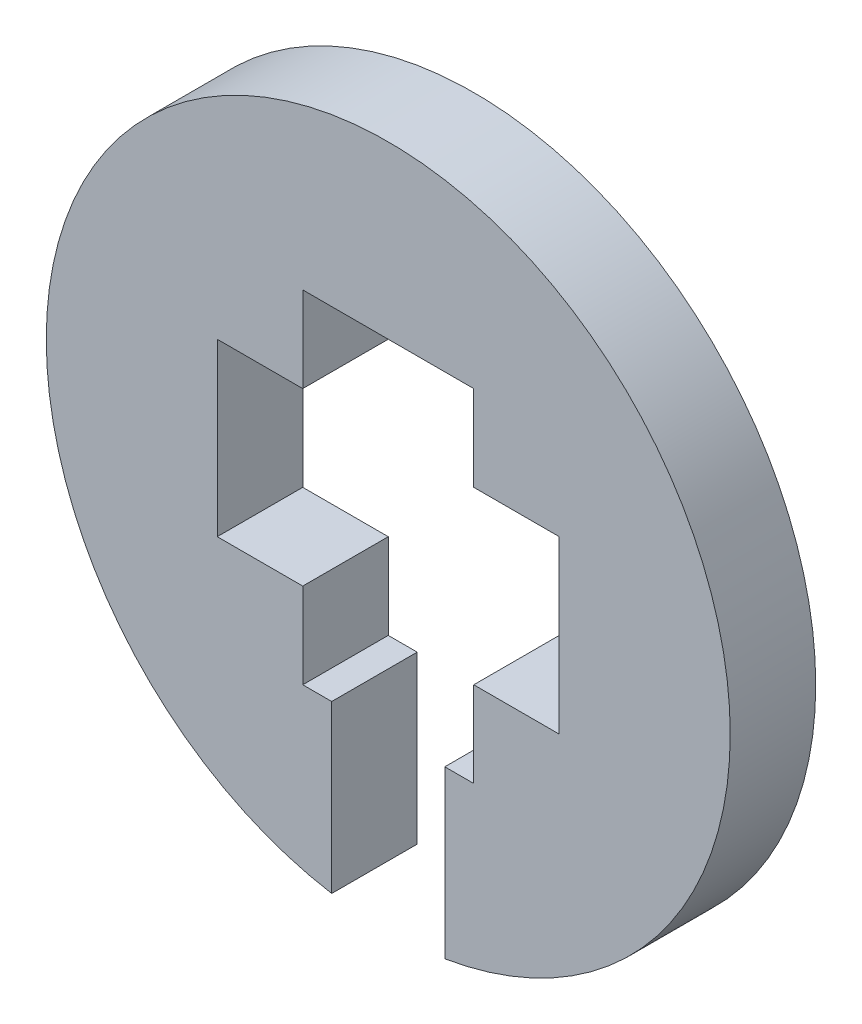
ISO-10303-21;
HEADER;
FILE_DESCRIPTION(('STEP AP214'),'2;1');
FILE_NAME('part.step','',(''),(''),'','','');
FILE_SCHEMA(('AUTOMOTIVE_DESIGN { 1 0 10303 214 1 1 1 1 }'));
ENDSEC;
DATA;
#1=APPLICATION_CONTEXT('core data for automotive mechanical design processes');
#2=APPLICATION_PROTOCOL_DEFINITION('international standard','automotive_design',2000,#1);
#3=PRODUCT_CONTEXT('',#1,'mechanical');
#4=PRODUCT('Part','Part','',(#3));
#5=PRODUCT_RELATED_PRODUCT_CATEGORY('part','',(#4));
#6=PRODUCT_DEFINITION_FORMATION('','',#4);
#7=PRODUCT_DEFINITION_CONTEXT('part definition',#1,'design');
#8=PRODUCT_DEFINITION('design','',#6,#7);
#9=PRODUCT_DEFINITION_SHAPE('','',#8);
#10=(LENGTH_UNIT() NAMED_UNIT(*) SI_UNIT(.MILLI.,.METRE.));
#11=(NAMED_UNIT(*) PLANE_ANGLE_UNIT() SI_UNIT($,.RADIAN.));
#12=(NAMED_UNIT(*) SI_UNIT($,.STERADIAN.) SOLID_ANGLE_UNIT());
#13=UNCERTAINTY_MEASURE_WITH_UNIT(LENGTH_MEASURE(1.E-05),#10,'distance_accuracy_value','');
#14=(GEOMETRIC_REPRESENTATION_CONTEXT(3) GLOBAL_UNCERTAINTY_ASSIGNED_CONTEXT((#13)) GLOBAL_UNIT_ASSIGNED_CONTEXT((#10,
#11,#12)) REPRESENTATION_CONTEXT('',''));
#15=CARTESIAN_POINT('',(0.,0.,0.));
#16=DIRECTION('',(0.,0.,1.));
#17=DIRECTION('',(1.,0.,0.));
#18=AXIS2_PLACEMENT_3D('',#15,#16,#17);
#19=CARTESIAN_POINT('',(-1.5875,-3.175,1.5875));
#20=DIRECTION('',(0.,1.,0.));
#21=DIRECTION('',(0.,0.,1.));
#22=AXIS2_PLACEMENT_3D('',#19,#20,#21);
#23=PLANE('',#22);
#24=DIRECTION('',(0.,0.,-1.));
#25=VECTOR('',#24,1.);
#26=CARTESIAN_POINT('',(1.05,-3.175,1.5875));
#27=LINE('',#26,#25);
#28=CARTESIAN_POINT('',(1.05,-3.175,1.5875));
#29=VERTEX_POINT('',#28);
#30=CARTESIAN_POINT('',(1.05,-3.175,0.));
#31=VERTEX_POINT('',#30);
#32=EDGE_CURVE('E151',#29,#31,#27,.T.);
#33=ORIENTED_EDGE('',*,*,#32,.F.);
#34=DIRECTION('',(1.,0.,0.));
#35=VECTOR('',#34,1.);
#36=CARTESIAN_POINT('',(-1.5875,-3.175,1.5875));
#37=LINE('',#36,#35);
#38=CARTESIAN_POINT('',(1.5875,-3.175,1.5875));
#39=VERTEX_POINT('',#38);
#40=EDGE_CURVE('E165',#29,#39,#37,.T.);
#41=ORIENTED_EDGE('',*,*,#40,.T.);
#42=DIRECTION('',(0.,0.,-1.));
#43=VECTOR('',#42,1.);
#44=CARTESIAN_POINT('',(1.5875,-3.175,1.5875));
#45=LINE('',#44,#43);
#46=CARTESIAN_POINT('',(1.5875,-3.175,0.));
#47=VERTEX_POINT('',#46);
#48=EDGE_CURVE('E249',#39,#47,#45,.T.);
#49=ORIENTED_EDGE('',*,*,#48,.T.);
#50=DIRECTION('',(1.,0.,0.));
#51=VECTOR('',#50,1.);
#52=CARTESIAN_POINT('',(-1.5875,-3.175,0.));
#53=LINE('',#52,#51);
#54=EDGE_CURVE('E195',#31,#47,#53,.T.);
#55=ORIENTED_EDGE('',*,*,#54,.F.);
#56=EDGE_LOOP('',(#33,#41,#49,#55));
#57=FACE_BOUND('',#56,.T.);
#58=ADVANCED_FACE('F33',(#57),#23,.T.);
#59=CARTESIAN_POINT('',(0.,0.,1.5875));
#60=DIRECTION('',(0.,0.,1.));
#61=DIRECTION('',(1.,0.,0.));
#62=AXIS2_PLACEMENT_3D('',#59,#60,#61);
#63=PLANE('',#62);
#64=DIRECTION('',(0.,-1.,0.));
#65=VECTOR('',#64,1.);
#66=CARTESIAN_POINT('',(1.05,-6.35,1.5875));
#67=LINE('',#66,#65);
#68=CARTESIAN_POINT('',(1.05,-6.26258732474047,1.5875));
#69=VERTEX_POINT('',#68);
#70=EDGE_CURVE('E48',#29,#69,#67,.T.);
#71=ORIENTED_EDGE('',*,*,#70,.T.);
#72=CARTESIAN_POINT('',(0.,0.,1.5875));
#73=DIRECTION('',(0.,0.,1.));
#74=DIRECTION('',(1.,0.,0.));
#75=AXIS2_PLACEMENT_3D('',#72,#73,#74);
#76=CIRCLE('',#75,6.35);
#77=CARTESIAN_POINT('',(-1.05,-6.26258732474047,1.5875));
#78=VERTEX_POINT('',#77);
#79=EDGE_CURVE('E11',#69,#78,#76,.T.);
#80=ORIENTED_EDGE('',*,*,#79,.T.);
#81=DIRECTION('',(0.,1.,0.));
#82=VECTOR('',#81,1.);
#83=CARTESIAN_POINT('',(-1.05,-6.35,1.5875));
#84=LINE('',#83,#82);
#85=CARTESIAN_POINT('',(-1.05,-3.175,1.5875));
#86=VERTEX_POINT('',#85);
#87=EDGE_CURVE('E146',#78,#86,#84,.T.);
#88=ORIENTED_EDGE('',*,*,#87,.T.);
#89=CARTESIAN_POINT('',(-1.5875,-3.175,1.5875));
#90=VERTEX_POINT('',#89);
#91=EDGE_CURVE('E157',#90,#86,#37,.T.);
#92=ORIENTED_EDGE('',*,*,#91,.F.);
#93=DIRECTION('',(0.,-1.,0.));
#94=VECTOR('',#93,1.);
#95=CARTESIAN_POINT('',(-1.5875,-1.5875,1.5875));
#96=LINE('',#95,#94);
#97=CARTESIAN_POINT('',(-1.5875,-1.5875,1.5875));
#98=VERTEX_POINT('',#97);
#99=EDGE_CURVE('E169',#98,#90,#96,.T.);
#100=ORIENTED_EDGE('',*,*,#99,.F.);
#101=DIRECTION('',(1.,0.,0.));
#102=VECTOR('',#101,1.);
#103=CARTESIAN_POINT('',(-3.175,-1.5875,1.5875));
#104=LINE('',#103,#102);
#105=CARTESIAN_POINT('',(-3.175,-1.5875,1.5875));
#106=VERTEX_POINT('',#105);
#107=EDGE_CURVE('E189',#106,#98,#104,.T.);
#108=ORIENTED_EDGE('',*,*,#107,.F.);
#109=DIRECTION('',(0.,-1.,0.));
#110=VECTOR('',#109,1.);
#111=CARTESIAN_POINT('',(-3.175,-1.5875,1.5875));
#112=LINE('',#111,#110);
#113=CARTESIAN_POINT('',(-3.175,1.5875,1.5875));
#114=VERTEX_POINT('',#113);
#115=EDGE_CURVE('E186',#114,#106,#112,.T.);
#116=ORIENTED_EDGE('',*,*,#115,.F.);
#117=DIRECTION('',(-1.,0.,0.));
#118=VECTOR('',#117,1.);
#119=CARTESIAN_POINT('',(-3.175,1.5875,1.5875));
#120=LINE('',#119,#118);
#121=CARTESIAN_POINT('',(-1.5875,1.5875,1.5875));
#122=VERTEX_POINT('',#121);
#123=EDGE_CURVE('E184',#122,#114,#120,.T.);
#124=ORIENTED_EDGE('',*,*,#123,.F.);
#125=DIRECTION('',(0.,-1.,0.));
#126=VECTOR('',#125,1.);
#127=CARTESIAN_POINT('',(-1.5875,1.5875,1.5875));
#128=LINE('',#127,#126);
#129=CARTESIAN_POINT('',(-1.5875,3.175,1.5875));
#130=VERTEX_POINT('',#129);
#131=EDGE_CURVE('E182',#130,#122,#128,.T.);
#132=ORIENTED_EDGE('',*,*,#131,.F.);
#133=DIRECTION('',(-1.,0.,0.));
#134=VECTOR('',#133,1.);
#135=CARTESIAN_POINT('',(-1.5875,3.175,1.5875));
#136=LINE('',#135,#134);
#137=CARTESIAN_POINT('',(1.5875,3.175,1.5875));
#138=VERTEX_POINT('',#137);
#139=EDGE_CURVE('E180',#138,#130,#136,.T.);
#140=ORIENTED_EDGE('',*,*,#139,.F.);
#141=DIRECTION('',(0.,1.,0.));
#142=VECTOR('',#141,1.);
#143=CARTESIAN_POINT('',(1.5875,1.5875,1.5875));
#144=LINE('',#143,#142);
#145=CARTESIAN_POINT('',(1.5875,1.5875,1.5875));
#146=VERTEX_POINT('',#145);
#147=EDGE_CURVE('E178',#146,#138,#144,.T.);
#148=ORIENTED_EDGE('',*,*,#147,.F.);
#149=DIRECTION('',(-1.,0.,0.));
#150=VECTOR('',#149,1.);
#151=CARTESIAN_POINT('',(3.175,1.5875,1.5875));
#152=LINE('',#151,#150);
#153=CARTESIAN_POINT('',(3.175,1.5875,1.5875));
#154=VERTEX_POINT('',#153);
#155=EDGE_CURVE('E176',#154,#146,#152,.T.);
#156=ORIENTED_EDGE('',*,*,#155,.F.);
#157=DIRECTION('',(0.,1.,0.));
#158=VECTOR('',#157,1.);
#159=CARTESIAN_POINT('',(3.175,-1.5875,1.5875));
#160=LINE('',#159,#158);
#161=CARTESIAN_POINT('',(3.175,-1.5875,1.5875));
#162=VERTEX_POINT('',#161);
#163=EDGE_CURVE('E174',#162,#154,#160,.T.);
#164=ORIENTED_EDGE('',*,*,#163,.F.);
#165=DIRECTION('',(1.,0.,0.));
#166=VECTOR('',#165,1.);
#167=CARTESIAN_POINT('',(3.175,-1.5875,1.5875));
#168=LINE('',#167,#166);
#169=CARTESIAN_POINT('',(1.5875,-1.5875,1.5875));
#170=VERTEX_POINT('',#169);
#171=EDGE_CURVE('E167',#170,#162,#168,.T.);
#172=ORIENTED_EDGE('',*,*,#171,.F.);
#173=DIRECTION('',(0.,1.,0.));
#174=VECTOR('',#173,1.);
#175=CARTESIAN_POINT('',(1.5875,-1.5875,1.5875));
#176=LINE('',#175,#174);
#177=EDGE_CURVE('E164',#39,#170,#176,.T.);
#178=ORIENTED_EDGE('',*,*,#177,.F.);
#179=ORIENTED_EDGE('',*,*,#40,.F.);
#180=EDGE_LOOP('',(#71,#80,#88,#92,#100,#108,#116,#124,#132,#140,#148,#156,#164,#172,#178,#179));
#181=FACE_BOUND('',#180,.T.);
#182=ADVANCED_FACE('F155',(#181),#63,.T.);
#183=CARTESIAN_POINT('',(0.,0.,0.));
#184=DIRECTION('',(0.,0.,1.));
#185=DIRECTION('',(1.,0.,0.));
#186=AXIS2_PLACEMENT_3D('',#183,#184,#185);
#187=PLANE('',#186);
#188=CARTESIAN_POINT('',(0.,0.,0.));
#189=DIRECTION('',(0.,0.,1.));
#190=DIRECTION('',(1.,0.,0.));
#191=AXIS2_PLACEMENT_3D('',#188,#189,#190);
#192=CIRCLE('',#191,6.35);
#193=CARTESIAN_POINT('',(1.05,-6.26258732474047,0.));
#194=VERTEX_POINT('',#193);
#195=CARTESIAN_POINT('',(-1.05,-6.26258732474047,0.));
#196=VERTEX_POINT('',#195);
#197=EDGE_CURVE('E37',#194,#196,#192,.T.);
#198=ORIENTED_EDGE('',*,*,#197,.F.);
#199=DIRECTION('',(0.,-1.,0.));
#200=VECTOR('',#199,1.);
#201=CARTESIAN_POINT('',(1.05,-6.35,0.));
#202=LINE('',#201,#200);
#203=EDGE_CURVE('E261',#31,#194,#202,.T.);
#204=ORIENTED_EDGE('',*,*,#203,.F.);
#205=ORIENTED_EDGE('',*,*,#54,.T.);
#206=DIRECTION('',(0.,1.,0.));
#207=VECTOR('',#206,1.);
#208=CARTESIAN_POINT('',(1.5875,-1.5875,0.));
#209=LINE('',#208,#207);
#210=CARTESIAN_POINT('',(1.5875,-1.5875,0.));
#211=VERTEX_POINT('',#210);
#212=EDGE_CURVE('E199',#47,#211,#209,.T.);
#213=ORIENTED_EDGE('',*,*,#212,.T.);
#214=DIRECTION('',(1.,0.,0.));
#215=VECTOR('',#214,1.);
#216=CARTESIAN_POINT('',(3.175,-1.5875,0.));
#217=LINE('',#216,#215);
#218=CARTESIAN_POINT('',(3.175,-1.5875,0.));
#219=VERTEX_POINT('',#218);
#220=EDGE_CURVE('E202',#211,#219,#217,.T.);
#221=ORIENTED_EDGE('',*,*,#220,.T.);
#222=DIRECTION('',(0.,1.,0.));
#223=VECTOR('',#222,1.);
#224=CARTESIAN_POINT('',(3.175,-1.5875,0.));
#225=LINE('',#224,#223);
#226=CARTESIAN_POINT('',(3.175,1.5875,0.));
#227=VERTEX_POINT('',#226);
#228=EDGE_CURVE('E205',#219,#227,#225,.T.);
#229=ORIENTED_EDGE('',*,*,#228,.T.);
#230=DIRECTION('',(-1.,0.,0.));
#231=VECTOR('',#230,1.);
#232=CARTESIAN_POINT('',(3.175,1.5875,0.));
#233=LINE('',#232,#231);
#234=CARTESIAN_POINT('',(1.5875,1.5875,0.));
#235=VERTEX_POINT('',#234);
#236=EDGE_CURVE('E208',#227,#235,#233,.T.);
#237=ORIENTED_EDGE('',*,*,#236,.T.);
#238=DIRECTION('',(0.,1.,0.));
#239=VECTOR('',#238,1.);
#240=CARTESIAN_POINT('',(1.5875,1.5875,0.));
#241=LINE('',#240,#239);
#242=CARTESIAN_POINT('',(1.5875,3.175,0.));
#243=VERTEX_POINT('',#242);
#244=EDGE_CURVE('E211',#235,#243,#241,.T.);
#245=ORIENTED_EDGE('',*,*,#244,.T.);
#246=DIRECTION('',(-1.,0.,0.));
#247=VECTOR('',#246,1.);
#248=CARTESIAN_POINT('',(-1.5875,3.175,0.));
#249=LINE('',#248,#247);
#250=CARTESIAN_POINT('',(-1.5875,3.175,0.));
#251=VERTEX_POINT('',#250);
#252=EDGE_CURVE('E214',#243,#251,#249,.T.);
#253=ORIENTED_EDGE('',*,*,#252,.T.);
#254=DIRECTION('',(0.,-1.,0.));
#255=VECTOR('',#254,1.);
#256=CARTESIAN_POINT('',(-1.5875,1.5875,0.));
#257=LINE('',#256,#255);
#258=CARTESIAN_POINT('',(-1.5875,1.5875,0.));
#259=VERTEX_POINT('',#258);
#260=EDGE_CURVE('E217',#251,#259,#257,.T.);
#261=ORIENTED_EDGE('',*,*,#260,.T.);
#262=DIRECTION('',(-1.,0.,0.));
#263=VECTOR('',#262,1.);
#264=CARTESIAN_POINT('',(-3.175,1.5875,0.));
#265=LINE('',#264,#263);
#266=CARTESIAN_POINT('',(-3.175,1.5875,0.));
#267=VERTEX_POINT('',#266);
#268=EDGE_CURVE('E220',#259,#267,#265,.T.);
#269=ORIENTED_EDGE('',*,*,#268,.T.);
#270=DIRECTION('',(0.,-1.,0.));
#271=VECTOR('',#270,1.);
#272=CARTESIAN_POINT('',(-3.175,-1.5875,0.));
#273=LINE('',#272,#271);
#274=CARTESIAN_POINT('',(-3.175,-1.5875,0.));
#275=VERTEX_POINT('',#274);
#276=EDGE_CURVE('E223',#267,#275,#273,.T.);
#277=ORIENTED_EDGE('',*,*,#276,.T.);
#278=DIRECTION('',(1.,0.,0.));
#279=VECTOR('',#278,1.);
#280=CARTESIAN_POINT('',(-3.175,-1.5875,0.));
#281=LINE('',#280,#279);
#282=CARTESIAN_POINT('',(-1.5875,-1.5875,0.));
#283=VERTEX_POINT('',#282);
#284=EDGE_CURVE('E226',#275,#283,#281,.T.);
#285=ORIENTED_EDGE('',*,*,#284,.T.);
#286=DIRECTION('',(0.,-1.,0.));
#287=VECTOR('',#286,1.);
#288=CARTESIAN_POINT('',(-1.5875,-1.5875,0.));
#289=LINE('',#288,#287);
#290=CARTESIAN_POINT('',(-1.5875,-3.175,0.));
#291=VERTEX_POINT('',#290);
#292=EDGE_CURVE('E192',#283,#291,#289,.T.);
#293=ORIENTED_EDGE('',*,*,#292,.T.);
#294=CARTESIAN_POINT('',(-1.05,-3.175,0.));
#295=VERTEX_POINT('',#294);
#296=EDGE_CURVE('E197',#291,#295,#53,.T.);
#297=ORIENTED_EDGE('',*,*,#296,.T.);
#298=DIRECTION('',(0.,1.,0.));
#299=VECTOR('',#298,1.);
#300=CARTESIAN_POINT('',(-1.05,-6.35,0.));
#301=LINE('',#300,#299);
#302=EDGE_CURVE('E56',#196,#295,#301,.T.);
#303=ORIENTED_EDGE('',*,*,#302,.F.);
#304=EDGE_LOOP('',(#198,#204,#205,#213,#221,#229,#237,#245,#253,#261,#269,#277,#285,#293,#297,#303));
#305=FACE_BOUND('',#304,.T.);
#306=ADVANCED_FACE('F260',(#305),#187,.F.);
#307=CARTESIAN_POINT('',(0.,0.,1.5875));
#308=DIRECTION('',(0.,0.,-1.));
#309=DIRECTION('',(-1.,0.,0.));
#310=AXIS2_PLACEMENT_3D('',#307,#308,#309);
#311=CYLINDRICAL_SURFACE('',#310,6.35);
#312=ORIENTED_EDGE('',*,*,#79,.F.);
#313=DIRECTION('',(0.,0.,-1.));
#314=VECTOR('',#313,1.);
#315=CARTESIAN_POINT('',(1.05,-6.26258732474047,1.5875));
#316=LINE('',#315,#314);
#317=EDGE_CURVE('E196',#69,#194,#316,.T.);
#318=ORIENTED_EDGE('',*,*,#317,.T.);
#319=ORIENTED_EDGE('',*,*,#197,.T.);
#320=DIRECTION('',(0.,0.,-1.));
#321=VECTOR('',#320,1.);
#322=CARTESIAN_POINT('',(-1.05,-6.26258732474047,1.5875));
#323=LINE('',#322,#321);
#324=EDGE_CURVE('E257',#196,#78,#323,.F.);
#325=ORIENTED_EDGE('',*,*,#324,.T.);
#326=EDGE_LOOP('',(#312,#318,#319,#325));
#327=FACE_BOUND('',#326,.T.);
#328=ADVANCED_FACE('F35',(#327),#311,.T.);
#329=CARTESIAN_POINT('',(-1.5875,-1.5875,1.5875));
#330=DIRECTION('',(1.,0.,0.));
#331=DIRECTION('',(0.,1.,0.));
#332=AXIS2_PLACEMENT_3D('',#329,#330,#331);
#333=PLANE('',#332);
#334=ORIENTED_EDGE('',*,*,#292,.F.);
#335=DIRECTION('',(0.,0.,-1.));
#336=VECTOR('',#335,1.);
#337=CARTESIAN_POINT('',(-1.5875,-1.5875,1.5875));
#338=LINE('',#337,#336);
#339=EDGE_CURVE('E191',#98,#283,#338,.T.);
#340=ORIENTED_EDGE('',*,*,#339,.F.);
#341=ORIENTED_EDGE('',*,*,#99,.T.);
#342=DIRECTION('',(0.,0.,-1.));
#343=VECTOR('',#342,1.);
#344=CARTESIAN_POINT('',(-1.5875,-3.175,1.5875));
#345=LINE('',#344,#343);
#346=EDGE_CURVE('E163',#90,#291,#345,.T.);
#347=ORIENTED_EDGE('',*,*,#346,.T.);
#348=EDGE_LOOP('',(#334,#340,#341,#347));
#349=FACE_BOUND('',#348,.T.);
#350=ADVANCED_FACE('F321',(#349),#333,.T.);
#351=DIRECTION('',(0.,0.,-1.));
#352=VECTOR('',#351,1.);
#353=CARTESIAN_POINT('',(-1.05,-3.175,1.5875));
#354=LINE('',#353,#352);
#355=EDGE_CURVE('E143',#86,#295,#354,.T.);
#356=ORIENTED_EDGE('',*,*,#355,.T.);
#357=ORIENTED_EDGE('',*,*,#296,.F.);
#358=ORIENTED_EDGE('',*,*,#346,.F.);
#359=ORIENTED_EDGE('',*,*,#91,.T.);
#360=EDGE_LOOP('',(#356,#357,#358,#359));
#361=FACE_BOUND('',#360,.T.);
#362=ADVANCED_FACE('F161',(#361),#23,.T.);
#363=CARTESIAN_POINT('',(1.5875,-1.5875,1.5875));
#364=DIRECTION('',(-1.,0.,0.));
#365=DIRECTION('',(0.,-1.,0.));
#366=AXIS2_PLACEMENT_3D('',#363,#364,#365);
#367=PLANE('',#366);
#368=ORIENTED_EDGE('',*,*,#212,.F.);
#369=ORIENTED_EDGE('',*,*,#48,.F.);
#370=ORIENTED_EDGE('',*,*,#177,.T.);
#371=DIRECTION('',(0.,0.,-1.));
#372=VECTOR('',#371,1.);
#373=CARTESIAN_POINT('',(1.5875,-1.5875,1.5875));
#374=LINE('',#373,#372);
#375=EDGE_CURVE('E247',#170,#211,#374,.T.);
#376=ORIENTED_EDGE('',*,*,#375,.T.);
#377=EDGE_LOOP('',(#368,#369,#370,#376));
#378=FACE_BOUND('',#377,.T.);
#379=ADVANCED_FACE('F278',(#378),#367,.T.);
#380=CARTESIAN_POINT('',(3.175,-1.5875,1.5875));
#381=DIRECTION('',(0.,1.,0.));
#382=DIRECTION('',(-1.,0.,0.));
#383=AXIS2_PLACEMENT_3D('',#380,#381,#382);
#384=PLANE('',#383);
#385=ORIENTED_EDGE('',*,*,#220,.F.);
#386=ORIENTED_EDGE('',*,*,#375,.F.);
#387=ORIENTED_EDGE('',*,*,#171,.T.);
#388=DIRECTION('',(0.,0.,-1.));
#389=VECTOR('',#388,1.);
#390=CARTESIAN_POINT('',(3.175,-1.5875,1.5875));
#391=LINE('',#390,#389);
#392=EDGE_CURVE('E245',#162,#219,#391,.T.);
#393=ORIENTED_EDGE('',*,*,#392,.T.);
#394=EDGE_LOOP('',(#385,#386,#387,#393));
#395=FACE_BOUND('',#394,.T.);
#396=ADVANCED_FACE('F281',(#395),#384,.T.);
#397=CARTESIAN_POINT('',(3.175,-1.5875,1.5875));
#398=DIRECTION('',(-1.,0.,0.));
#399=DIRECTION('',(0.,-1.,0.));
#400=AXIS2_PLACEMENT_3D('',#397,#398,#399);
#401=PLANE('',#400);
#402=ORIENTED_EDGE('',*,*,#228,.F.);
#403=ORIENTED_EDGE('',*,*,#392,.F.);
#404=ORIENTED_EDGE('',*,*,#163,.T.);
#405=DIRECTION('',(0.,0.,-1.));
#406=VECTOR('',#405,1.);
#407=CARTESIAN_POINT('',(3.175,1.5875,1.5875));
#408=LINE('',#407,#406);
#409=EDGE_CURVE('E243',#154,#227,#408,.T.);
#410=ORIENTED_EDGE('',*,*,#409,.T.);
#411=EDGE_LOOP('',(#402,#403,#404,#410));
#412=FACE_BOUND('',#411,.T.);
#413=ADVANCED_FACE('F286',(#412),#401,.T.);
#414=CARTESIAN_POINT('',(3.175,1.5875,1.5875));
#415=DIRECTION('',(0.,-1.,0.));
#416=DIRECTION('',(1.,0.,0.));
#417=AXIS2_PLACEMENT_3D('',#414,#415,#416);
#418=PLANE('',#417);
#419=ORIENTED_EDGE('',*,*,#236,.F.);
#420=ORIENTED_EDGE('',*,*,#409,.F.);
#421=ORIENTED_EDGE('',*,*,#155,.T.);
#422=DIRECTION('',(0.,0.,-1.));
#423=VECTOR('',#422,1.);
#424=CARTESIAN_POINT('',(1.5875,1.5875,1.5875));
#425=LINE('',#424,#423);
#426=EDGE_CURVE('E241',#146,#235,#425,.T.);
#427=ORIENTED_EDGE('',*,*,#426,.T.);
#428=EDGE_LOOP('',(#419,#420,#421,#427));
#429=FACE_BOUND('',#428,.T.);
#430=ADVANCED_FACE('F290',(#429),#418,.T.);
#431=CARTESIAN_POINT('',(1.5875,1.5875,1.5875));
#432=DIRECTION('',(-1.,0.,0.));
#433=DIRECTION('',(0.,-1.,0.));
#434=AXIS2_PLACEMENT_3D('',#431,#432,#433);
#435=PLANE('',#434);
#436=ORIENTED_EDGE('',*,*,#244,.F.);
#437=ORIENTED_EDGE('',*,*,#426,.F.);
#438=ORIENTED_EDGE('',*,*,#147,.T.);
#439=DIRECTION('',(0.,0.,-1.));
#440=VECTOR('',#439,1.);
#441=CARTESIAN_POINT('',(1.5875,3.175,1.5875));
#442=LINE('',#441,#440);
#443=EDGE_CURVE('E239',#138,#243,#442,.T.);
#444=ORIENTED_EDGE('',*,*,#443,.T.);
#445=EDGE_LOOP('',(#436,#437,#438,#444));
#446=FACE_BOUND('',#445,.T.);
#447=ADVANCED_FACE('F295',(#446),#435,.T.);
#448=CARTESIAN_POINT('',(-1.5875,3.175,1.5875));
#449=DIRECTION('',(0.,-1.,0.));
#450=DIRECTION('',(0.,0.,-1.));
#451=AXIS2_PLACEMENT_3D('',#448,#449,#450);
#452=PLANE('',#451);
#453=ORIENTED_EDGE('',*,*,#252,.F.);
#454=ORIENTED_EDGE('',*,*,#443,.F.);
#455=ORIENTED_EDGE('',*,*,#139,.T.);
#456=DIRECTION('',(0.,0.,-1.));
#457=VECTOR('',#456,1.);
#458=CARTESIAN_POINT('',(-1.5875,3.175,1.5875));
#459=LINE('',#458,#457);
#460=EDGE_CURVE('E237',#130,#251,#459,.T.);
#461=ORIENTED_EDGE('',*,*,#460,.T.);
#462=EDGE_LOOP('',(#453,#454,#455,#461));
#463=FACE_BOUND('',#462,.T.);
#464=ADVANCED_FACE('F300',(#463),#452,.T.);
#465=CARTESIAN_POINT('',(-1.5875,1.5875,1.5875));
#466=DIRECTION('',(1.,0.,0.));
#467=DIRECTION('',(0.,0.,-1.));
#468=AXIS2_PLACEMENT_3D('',#465,#466,#467);
#469=PLANE('',#468);
#470=ORIENTED_EDGE('',*,*,#260,.F.);
#471=ORIENTED_EDGE('',*,*,#460,.F.);
#472=ORIENTED_EDGE('',*,*,#131,.T.);
#473=DIRECTION('',(0.,0.,-1.));
#474=VECTOR('',#473,1.);
#475=CARTESIAN_POINT('',(-1.5875,1.5875,1.5875));
#476=LINE('',#475,#474);
#477=EDGE_CURVE('E235',#122,#259,#476,.T.);
#478=ORIENTED_EDGE('',*,*,#477,.T.);
#479=EDGE_LOOP('',(#470,#471,#472,#478));
#480=FACE_BOUND('',#479,.T.);
#481=ADVANCED_FACE('F305',(#480),#469,.T.);
#482=CARTESIAN_POINT('',(-3.175,1.5875,1.5875));
#483=DIRECTION('',(0.,-1.,0.));
#484=DIRECTION('',(1.,0.,0.));
#485=AXIS2_PLACEMENT_3D('',#482,#483,#484);
#486=PLANE('',#485);
#487=ORIENTED_EDGE('',*,*,#268,.F.);
#488=ORIENTED_EDGE('',*,*,#477,.F.);
#489=ORIENTED_EDGE('',*,*,#123,.T.);
#490=DIRECTION('',(0.,0.,-1.));
#491=VECTOR('',#490,1.);
#492=CARTESIAN_POINT('',(-3.175,1.5875,1.5875));
#493=LINE('',#492,#491);
#494=EDGE_CURVE('E233',#114,#267,#493,.T.);
#495=ORIENTED_EDGE('',*,*,#494,.T.);
#496=EDGE_LOOP('',(#487,#488,#489,#495));
#497=FACE_BOUND('',#496,.T.);
#498=ADVANCED_FACE('F310',(#497),#486,.T.);
#499=CARTESIAN_POINT('',(-3.175,-1.5875,1.5875));
#500=DIRECTION('',(1.,0.,0.));
#501=DIRECTION('',(0.,1.,0.));
#502=AXIS2_PLACEMENT_3D('',#499,#500,#501);
#503=PLANE('',#502);
#504=ORIENTED_EDGE('',*,*,#276,.F.);
#505=ORIENTED_EDGE('',*,*,#494,.F.);
#506=ORIENTED_EDGE('',*,*,#115,.T.);
#507=DIRECTION('',(0.,0.,-1.));
#508=VECTOR('',#507,1.);
#509=CARTESIAN_POINT('',(-3.175,-1.5875,1.5875));
#510=LINE('',#509,#508);
#511=EDGE_CURVE('E231',#106,#275,#510,.T.);
#512=ORIENTED_EDGE('',*,*,#511,.T.);
#513=EDGE_LOOP('',(#504,#505,#506,#512));
#514=FACE_BOUND('',#513,.T.);
#515=ADVANCED_FACE('F315',(#514),#503,.T.);
#516=CARTESIAN_POINT('',(-3.175,-1.5875,1.5875));
#517=DIRECTION('',(0.,1.,0.));
#518=DIRECTION('',(-1.,0.,0.));
#519=AXIS2_PLACEMENT_3D('',#516,#517,#518);
#520=PLANE('',#519);
#521=ORIENTED_EDGE('',*,*,#284,.F.);
#522=ORIENTED_EDGE('',*,*,#511,.F.);
#523=ORIENTED_EDGE('',*,*,#107,.T.);
#524=ORIENTED_EDGE('',*,*,#339,.T.);
#525=EDGE_LOOP('',(#521,#522,#523,#524));
#526=FACE_BOUND('',#525,.T.);
#527=ADVANCED_FACE('F319',(#526),#520,.T.);
#528=CARTESIAN_POINT('',(-1.05,-6.35,1.5875));
#529=DIRECTION('',(-1.,0.,0.));
#530=DIRECTION('',(0.,-1.,0.));
#531=AXIS2_PLACEMENT_3D('',#528,#529,#530);
#532=PLANE('',#531);
#533=ORIENTED_EDGE('',*,*,#302,.T.);
#534=ORIENTED_EDGE('',*,*,#355,.F.);
#535=ORIENTED_EDGE('',*,*,#87,.F.);
#536=ORIENTED_EDGE('',*,*,#324,.F.);
#537=EDGE_LOOP('',(#533,#534,#535,#536));
#538=FACE_BOUND('',#537,.T.);
#539=ADVANCED_FACE('F145',(#538),#532,.F.);
#540=CARTESIAN_POINT('',(1.05,-6.35,1.5875));
#541=DIRECTION('',(1.,0.,0.));
#542=DIRECTION('',(0.,1.,0.));
#543=AXIS2_PLACEMENT_3D('',#540,#541,#542);
#544=PLANE('',#543);
#545=ORIENTED_EDGE('',*,*,#70,.F.);
#546=ORIENTED_EDGE('',*,*,#32,.T.);
#547=ORIENTED_EDGE('',*,*,#203,.T.);
#548=ORIENTED_EDGE('',*,*,#317,.F.);
#549=EDGE_LOOP('',(#545,#546,#547,#548));
#550=FACE_BOUND('',#549,.T.);
#551=ADVANCED_FACE('F268',(#550),#544,.F.);
#552=CLOSED_SHELL('',(#58,#182,#306,#328,#350,#362,#379,#396,#413,#430,#447,#464,#481,#498,#515,
#527,#539,#551));
#553=MANIFOLD_SOLID_BREP('B2',#552);
#554=ADVANCED_BREP_SHAPE_REPRESENTATION('',(#18,#553),#14);
#555=SHAPE_DEFINITION_REPRESENTATION(#9,#554);
ENDSEC;
END-ISO-10303-21;
